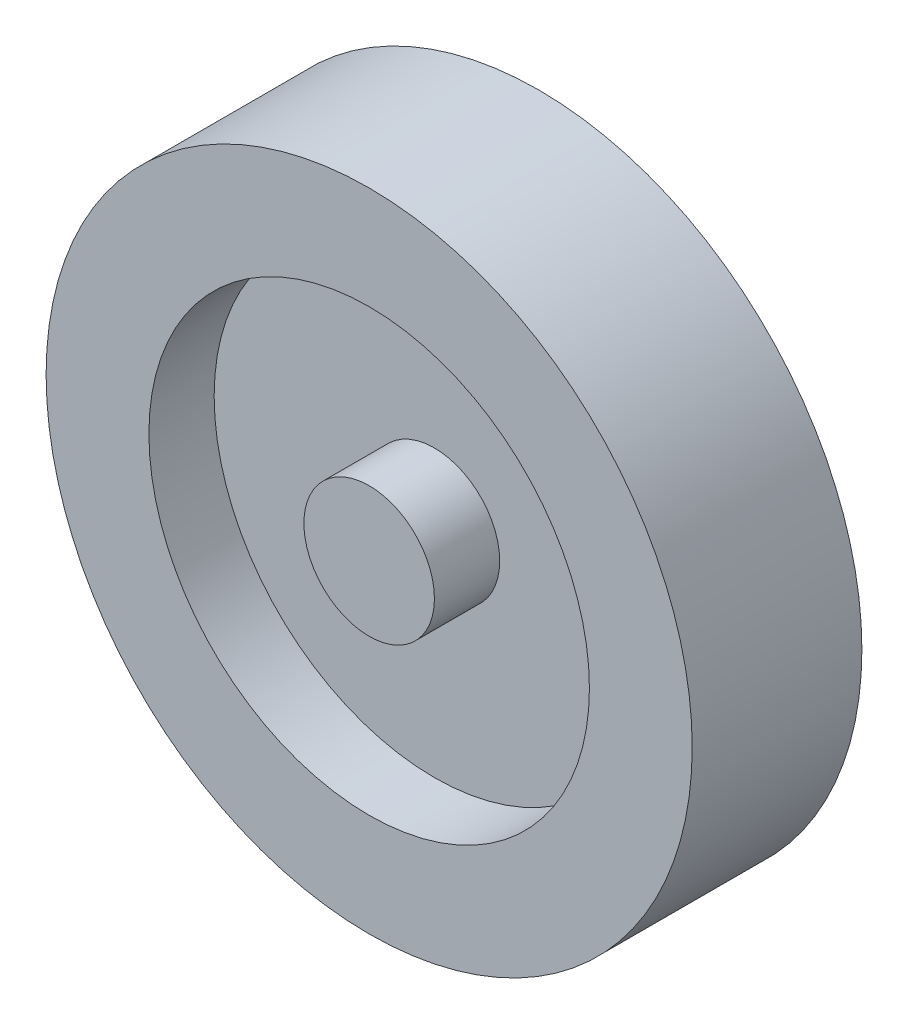
ISO-10303-21;
HEADER;
FILE_DESCRIPTION(('STEP AP214'),'2;1');
FILE_NAME('part.step','',(''),(''),'','','');
FILE_SCHEMA(('AUTOMOTIVE_DESIGN { 1 0 10303 214 1 1 1 1 }'));
ENDSEC;
DATA;
#1=APPLICATION_CONTEXT('core data for automotive mechanical design processes');
#2=APPLICATION_PROTOCOL_DEFINITION('international standard','automotive_design',2000,#1);
#3=PRODUCT_CONTEXT('',#1,'mechanical');
#4=PRODUCT('Part','Part','',(#3));
#5=PRODUCT_RELATED_PRODUCT_CATEGORY('part','',(#4));
#6=PRODUCT_DEFINITION_FORMATION('','',#4);
#7=PRODUCT_DEFINITION_CONTEXT('part definition',#1,'design');
#8=PRODUCT_DEFINITION('design','',#6,#7);
#9=PRODUCT_DEFINITION_SHAPE('','',#8);
#10=(LENGTH_UNIT() NAMED_UNIT(*) SI_UNIT(.MILLI.,.METRE.));
#11=(NAMED_UNIT(*) PLANE_ANGLE_UNIT() SI_UNIT($,.RADIAN.));
#12=(NAMED_UNIT(*) SI_UNIT($,.STERADIAN.) SOLID_ANGLE_UNIT());
#13=UNCERTAINTY_MEASURE_WITH_UNIT(LENGTH_MEASURE(1.E-05),#10,'distance_accuracy_value','');
#14=(GEOMETRIC_REPRESENTATION_CONTEXT(3) GLOBAL_UNCERTAINTY_ASSIGNED_CONTEXT((#13)) GLOBAL_UNIT_ASSIGNED_CONTEXT((#10,
#11,#12)) REPRESENTATION_CONTEXT('',''));
#15=CARTESIAN_POINT('',(0.,0.,0.));
#16=DIRECTION('',(0.,0.,1.));
#17=DIRECTION('',(1.,0.,0.));
#18=AXIS2_PLACEMENT_3D('',#15,#16,#17);
#19=CARTESIAN_POINT('',(0.,0.,13.));
#20=DIRECTION('',(0.,0.,-1.));
#21=DIRECTION('',(-1.,0.,0.));
#22=AXIS2_PLACEMENT_3D('',#19,#20,#21);
#23=CYLINDRICAL_SURFACE('',#22,49.5);
#24=CARTESIAN_POINT('',(0.,0.,13.));
#25=DIRECTION('',(0.,0.,1.));
#26=DIRECTION('',(1.,0.,0.));
#27=AXIS2_PLACEMENT_3D('',#24,#25,#26);
#28=CIRCLE('',#27,49.5);
#29=CARTESIAN_POINT('',(-49.5,0.,13.));
#30=VERTEX_POINT('',#29);
#31=EDGE_CURVE('E10',#30,#30,#28,.T.);
#32=CARTESIAN_POINT('',(0.,0.,-13.));
#33=DIRECTION('',(0.,0.,1.));
#34=DIRECTION('',(1.,0.,0.));
#35=AXIS2_PLACEMENT_3D('',#32,#33,#34);
#36=CIRCLE('',#35,49.5);
#37=CARTESIAN_POINT('',(-49.5,0.,-13.));
#38=VERTEX_POINT('',#37);
#39=EDGE_CURVE('E64',#38,#38,#36,.T.);
#40=CARTESIAN_POINT('',(-49.5,0.,13.));
#41=CARTESIAN_POINT('',(-49.5,0.,12.7291666666667));
#42=CARTESIAN_POINT('',(-49.5,0.,12.4583333333333));
#43=CARTESIAN_POINT('',(-49.5,0.,11.9166666666667));
#44=CARTESIAN_POINT('',(-49.5,0.,11.6458333333333));
#45=CARTESIAN_POINT('',(-49.5,0.,11.1041666666667));
#46=CARTESIAN_POINT('',(-49.5,0.,10.8333333333333));
#47=CARTESIAN_POINT('',(-49.5,0.,10.2916666666667));
#48=CARTESIAN_POINT('',(-49.5,0.,10.0208333333333));
#49=CARTESIAN_POINT('',(-49.5,0.,9.47916666666667));
#50=CARTESIAN_POINT('',(-49.5,0.,9.20833333333333));
#51=CARTESIAN_POINT('',(-49.5,0.,8.66666666666667));
#52=CARTESIAN_POINT('',(-49.5,0.,8.39583333333333));
#53=CARTESIAN_POINT('',(-49.5,0.,7.85416666666667));
#54=CARTESIAN_POINT('',(-49.5,0.,7.58333333333333));
#55=CARTESIAN_POINT('',(-49.5,0.,7.04166666666667));
#56=CARTESIAN_POINT('',(-49.5,0.,6.77083333333333));
#57=CARTESIAN_POINT('',(-49.5,0.,6.22916666666667));
#58=CARTESIAN_POINT('',(-49.5,0.,5.95833333333333));
#59=CARTESIAN_POINT('',(-49.5,0.,5.41666666666667));
#60=CARTESIAN_POINT('',(-49.5,0.,5.14583333333333));
#61=CARTESIAN_POINT('',(-49.5,0.,4.60416666666667));
#62=CARTESIAN_POINT('',(-49.5,0.,4.33333333333333));
#63=CARTESIAN_POINT('',(-49.5,0.,3.79166666666667));
#64=CARTESIAN_POINT('',(-49.5,0.,3.52083333333333));
#65=CARTESIAN_POINT('',(-49.5,0.,2.97916666666667));
#66=CARTESIAN_POINT('',(-49.5,0.,2.70833333333333));
#67=CARTESIAN_POINT('',(-49.5,0.,2.16666666666667));
#68=CARTESIAN_POINT('',(-49.5,0.,1.89583333333333));
#69=CARTESIAN_POINT('',(-49.5,0.,1.35416666666667));
#70=CARTESIAN_POINT('',(-49.5,0.,1.08333333333333));
#71=CARTESIAN_POINT('',(-49.5,0.,0.541666666666667));
#72=CARTESIAN_POINT('',(-49.5,0.,0.270833333333333));
#73=CARTESIAN_POINT('',(-49.5,0.,-0.270833333333333));
#74=CARTESIAN_POINT('',(-49.5,0.,-0.541666666666667));
#75=CARTESIAN_POINT('',(-49.5,0.,-1.08333333333333));
#76=CARTESIAN_POINT('',(-49.5,0.,-1.35416666666667));
#77=CARTESIAN_POINT('',(-49.5,0.,-1.89583333333333));
#78=CARTESIAN_POINT('',(-49.5,0.,-2.16666666666667));
#79=CARTESIAN_POINT('',(-49.5,0.,-2.70833333333333));
#80=CARTESIAN_POINT('',(-49.5,0.,-2.97916666666667));
#81=CARTESIAN_POINT('',(-49.5,0.,-3.52083333333333));
#82=CARTESIAN_POINT('',(-49.5,0.,-3.79166666666667));
#83=CARTESIAN_POINT('',(-49.5,0.,-4.33333333333333));
#84=CARTESIAN_POINT('',(-49.5,0.,-4.60416666666667));
#85=CARTESIAN_POINT('',(-49.5,0.,-5.14583333333333));
#86=CARTESIAN_POINT('',(-49.5,0.,-5.41666666666667));
#87=CARTESIAN_POINT('',(-49.5,0.,-5.95833333333333));
#88=CARTESIAN_POINT('',(-49.5,0.,-6.22916666666667));
#89=CARTESIAN_POINT('',(-49.5,0.,-6.77083333333333));
#90=CARTESIAN_POINT('',(-49.5,0.,-7.04166666666667));
#91=CARTESIAN_POINT('',(-49.5,0.,-7.58333333333333));
#92=CARTESIAN_POINT('',(-49.5,0.,-7.85416666666667));
#93=CARTESIAN_POINT('',(-49.5,0.,-8.39583333333333));
#94=CARTESIAN_POINT('',(-49.5,0.,-8.66666666666667));
#95=CARTESIAN_POINT('',(-49.5,0.,-9.20833333333333));
#96=CARTESIAN_POINT('',(-49.5,0.,-9.47916666666667));
#97=CARTESIAN_POINT('',(-49.5,0.,-10.0208333333333));
#98=CARTESIAN_POINT('',(-49.5,0.,-10.2916666666667));
#99=CARTESIAN_POINT('',(-49.5,0.,-10.8333333333333));
#100=CARTESIAN_POINT('',(-49.5,0.,-11.1041666666667));
#101=CARTESIAN_POINT('',(-49.5,0.,-11.6458333333333));
#102=CARTESIAN_POINT('',(-49.5,0.,-11.9166666666667));
#103=CARTESIAN_POINT('',(-49.5,0.,-12.4583333333333));
#104=CARTESIAN_POINT('',(-49.5,0.,-12.7291666666667));
#105=CARTESIAN_POINT('',(-49.5,0.,-13.));
#106=B_SPLINE_CURVE_WITH_KNOTS('',3,(#40,#41,#42,#43,#44,#45,#46,#47,#48,#49,#50,#51,#52,#53,
#54,#55,#56,#57,#58,#59,#60,#61,#62,#63,#64,#65,#66,#67,#68,#69,#70,#71,#72,#73,#74,#75,#76,#77,
#78,#79,#80,#81,#82,#83,#84,#85,#86,#87,#88,#89,#90,#91,#92,#93,#94,#95,#96,#97,#98,#99,#100,
#101,#102,#103,#104,#105),.UNSPECIFIED.,.F.,.F.,(4,2,2,2,2,2,2,2,2,2,2,2,2,2,2,2,2,2,2,2,2,2,2,
2,2,2,2,2,2,2,2,2,4),(0.,0.812500000000001,1.625,2.4375,3.25,4.0625,4.875,5.6875,6.5,7.3125,
8.125,8.9375,9.75,10.5625,11.375,12.1875,13.,13.8125,14.625,15.4375,16.25,17.0625,17.875,
18.6875,19.5,20.3125,21.125,21.9375,22.75,23.5625,24.375,25.1875,26.),.UNSPECIFIED.);
#107=EDGE_CURVE('BSEAM44',#30,#38,#106,.T.);
#108=ORIENTED_EDGE('',*,*,#31,.F.);
#109=ORIENTED_EDGE('',*,*,#39,.T.);
#110=ORIENTED_EDGE('',*,*,#107,.T.);
#111=ORIENTED_EDGE('',*,*,#107,.F.);
#112=EDGE_LOOP('',(#108,#110,#109,#111));
#113=FACE_BOUND('',#112,.T.);
#114=ADVANCED_FACE('F44',(#113),#23,.T.);
#115=CARTESIAN_POINT('',(0.,0.,13.));
#116=DIRECTION('',(0.,0.,1.));
#117=DIRECTION('',(1.,0.,0.));
#118=AXIS2_PLACEMENT_3D('',#115,#116,#117);
#119=PLANE('',#118);
#120=CARTESIAN_POINT('',(0.,0.,13.));
#121=DIRECTION('',(0.,0.,1.));
#122=DIRECTION('',(1.,0.,0.));
#123=AXIS2_PLACEMENT_3D('',#120,#121,#122);
#124=CIRCLE('',#123,33.75);
#125=CARTESIAN_POINT('',(33.75,0.,13.));
#126=VERTEX_POINT('',#125);
#127=EDGE_CURVE('E54',#126,#126,#124,.T.);
#128=ORIENTED_EDGE('',*,*,#127,.F.);
#129=EDGE_LOOP('',(#128));
#130=FACE_BOUND('',#129,.T.);
#131=ORIENTED_EDGE('',*,*,#31,.T.);
#132=EDGE_LOOP('',(#131));
#133=FACE_BOUND('',#132,.T.);
#134=ADVANCED_FACE('F115',(#130,#133),#119,.T.);
#135=CARTESIAN_POINT('',(0.,0.,3.));
#136=DIRECTION('',(0.,0.,1.));
#137=DIRECTION('',(1.,0.,0.));
#138=AXIS2_PLACEMENT_3D('',#135,#136,#137);
#139=CYLINDRICAL_SURFACE('',#138,33.75);
#140=CARTESIAN_POINT('',(0.,0.,3.));
#141=DIRECTION('',(0.,0.,1.));
#142=DIRECTION('',(1.,0.,0.));
#143=AXIS2_PLACEMENT_3D('',#140,#141,#142);
#144=CIRCLE('',#143,33.75);
#145=CARTESIAN_POINT('',(33.75,0.,3.));
#146=VERTEX_POINT('',#145);
#147=EDGE_CURVE('E50',#146,#146,#144,.T.);
#148=ORIENTED_EDGE('',*,*,#147,.F.);
#149=EDGE_LOOP('',(#148));
#150=FACE_BOUND('',#149,.T.);
#151=ORIENTED_EDGE('',*,*,#127,.T.);
#152=EDGE_LOOP('',(#151));
#153=FACE_BOUND('',#152,.T.);
#154=ADVANCED_FACE('F120',(#150,#153),#139,.F.);
#155=CARTESIAN_POINT('',(0.,0.,3.));
#156=DIRECTION('',(0.,0.,1.));
#157=DIRECTION('',(1.,0.,0.));
#158=AXIS2_PLACEMENT_3D('',#155,#156,#157);
#159=PLANE('',#158);
#160=CARTESIAN_POINT('',(0.,0.,3.));
#161=DIRECTION('',(0.,0.,1.));
#162=DIRECTION('',(1.,0.,0.));
#163=AXIS2_PLACEMENT_3D('',#160,#161,#162);
#164=CIRCLE('',#163,10.);
#165=CARTESIAN_POINT('',(10.,0.,3.));
#166=VERTEX_POINT('',#165);
#167=EDGE_CURVE('E59',#166,#166,#164,.T.);
#168=ORIENTED_EDGE('',*,*,#167,.F.);
#169=EDGE_LOOP('',(#168));
#170=FACE_BOUND('',#169,.T.);
#171=ORIENTED_EDGE('',*,*,#147,.T.);
#172=EDGE_LOOP('',(#171));
#173=FACE_BOUND('',#172,.T.);
#174=ADVANCED_FACE('F141',(#170,#173),#159,.T.);
#175=CARTESIAN_POINT('',(0.,0.,3.));
#176=DIRECTION('',(0.,0.,1.));
#177=DIRECTION('',(1.,0.,0.));
#178=AXIS2_PLACEMENT_3D('',#175,#176,#177);
#179=CYLINDRICAL_SURFACE('',#178,10.);
#180=ORIENTED_EDGE('',*,*,#167,.T.);
#181=EDGE_LOOP('',(#180));
#182=FACE_BOUND('',#181,.T.);
#183=CARTESIAN_POINT('',(0.,0.,13.));
#184=DIRECTION('',(0.,0.,1.));
#185=DIRECTION('',(1.,0.,0.));
#186=AXIS2_PLACEMENT_3D('',#183,#184,#185);
#187=CIRCLE('',#186,10.);
#188=CARTESIAN_POINT('',(10.,0.,13.));
#189=VERTEX_POINT('',#188);
#190=EDGE_CURVE('E61',#189,#189,#187,.T.);
#191=ORIENTED_EDGE('',*,*,#190,.F.);
#192=EDGE_LOOP('',(#191));
#193=FACE_BOUND('',#192,.T.);
#194=ADVANCED_FACE('F136',(#182,#193),#179,.T.);
#195=ORIENTED_EDGE('',*,*,#190,.T.);
#196=EDGE_LOOP('',(#195));
#197=FACE_BOUND('',#196,.T.);
#198=ADVANCED_FACE('F122',(#197),#119,.T.);
#199=CARTESIAN_POINT('',(0.,0.,-13.));
#200=DIRECTION('',(0.,0.,-1.));
#201=DIRECTION('',(1.,0.,0.));
#202=AXIS2_PLACEMENT_3D('',#199,#200,#201);
#203=PLANE('',#202);
#204=CARTESIAN_POINT('',(0.,0.,-13.));
#205=DIRECTION('',(0.,0.,1.));
#206=DIRECTION('',(1.,0.,0.));
#207=AXIS2_PLACEMENT_3D('',#204,#205,#206);
#208=CIRCLE('',#207,33.75);
#209=CARTESIAN_POINT('',(33.75,0.,-13.));
#210=VERTEX_POINT('',#209);
#211=EDGE_CURVE('E70',#210,#210,#208,.T.);
#212=ORIENTED_EDGE('',*,*,#211,.T.);
#213=EDGE_LOOP('',(#212));
#214=FACE_BOUND('',#213,.T.);
#215=ORIENTED_EDGE('',*,*,#39,.F.);
#216=EDGE_LOOP('',(#215));
#217=FACE_BOUND('',#216,.T.);
#218=ADVANCED_FACE('F126',(#214,#217),#203,.T.);
#219=CARTESIAN_POINT('',(0.,0.,-3.));
#220=DIRECTION('',(0.,0.,-1.));
#221=DIRECTION('',(1.,0.,0.));
#222=AXIS2_PLACEMENT_3D('',#219,#220,#221);
#223=CYLINDRICAL_SURFACE('',#222,33.75);
#224=CARTESIAN_POINT('',(0.,0.,-3.));
#225=DIRECTION('',(0.,0.,1.));
#226=DIRECTION('',(1.,0.,0.));
#227=AXIS2_PLACEMENT_3D('',#224,#225,#226);
#228=CIRCLE('',#227,33.75);
#229=CARTESIAN_POINT('',(33.75,0.,-3.));
#230=VERTEX_POINT('',#229);
#231=EDGE_CURVE('E69',#230,#230,#228,.T.);
#232=ORIENTED_EDGE('',*,*,#231,.T.);
#233=EDGE_LOOP('',(#232));
#234=FACE_BOUND('',#233,.T.);
#235=ORIENTED_EDGE('',*,*,#211,.F.);
#236=EDGE_LOOP('',(#235));
#237=FACE_BOUND('',#236,.T.);
#238=ADVANCED_FACE('F110',(#234,#237),#223,.F.);
#239=CARTESIAN_POINT('',(0.,0.,-3.));
#240=DIRECTION('',(0.,0.,-1.));
#241=DIRECTION('',(1.,0.,0.));
#242=AXIS2_PLACEMENT_3D('',#239,#240,#241);
#243=PLANE('',#242);
#244=CARTESIAN_POINT('',(0.,0.,-3.));
#245=DIRECTION('',(0.,0.,1.));
#246=DIRECTION('',(1.,0.,0.));
#247=AXIS2_PLACEMENT_3D('',#244,#245,#246);
#248=CIRCLE('',#247,10.);
#249=CARTESIAN_POINT('',(10.,0.,-3.));
#250=VERTEX_POINT('',#249);
#251=EDGE_CURVE('E73',#250,#250,#248,.T.);
#252=ORIENTED_EDGE('',*,*,#251,.T.);
#253=EDGE_LOOP('',(#252));
#254=FACE_BOUND('',#253,.T.);
#255=ORIENTED_EDGE('',*,*,#231,.F.);
#256=EDGE_LOOP('',(#255));
#257=FACE_BOUND('',#256,.T.);
#258=ADVANCED_FACE('F104',(#254,#257),#243,.T.);
#259=CARTESIAN_POINT('',(0.,0.,-3.));
#260=DIRECTION('',(0.,0.,-1.));
#261=DIRECTION('',(1.,0.,0.));
#262=AXIS2_PLACEMENT_3D('',#259,#260,#261);
#263=CYLINDRICAL_SURFACE('',#262,10.);
#264=ORIENTED_EDGE('',*,*,#251,.F.);
#265=EDGE_LOOP('',(#264));
#266=FACE_BOUND('',#265,.T.);
#267=CARTESIAN_POINT('',(0.,0.,-31.5));
#268=DIRECTION('',(0.,0.,-1.));
#269=DIRECTION('',(-1.,0.,0.));
#270=AXIS2_PLACEMENT_3D('',#267,#268,#269);
#271=CIRCLE('',#270,10.);
#272=CARTESIAN_POINT('',(-10.,0.,-31.5));
#273=VERTEX_POINT('',#272);
#274=EDGE_CURVE('E78',#273,#273,#271,.T.);
#275=ORIENTED_EDGE('',*,*,#274,.F.);
#276=EDGE_LOOP('',(#275));
#277=FACE_BOUND('',#276,.T.);
#278=ADVANCED_FACE('F99',(#266,#277),#263,.T.);
#279=CARTESIAN_POINT('',(0.,0.,-31.5));
#280=DIRECTION('',(0.,0.,-1.));
#281=DIRECTION('',(-1.,0.,0.));
#282=AXIS2_PLACEMENT_3D('',#279,#280,#281);
#283=PLANE('',#282);
#284=CARTESIAN_POINT('',(0.,0.,-31.5));
#285=DIRECTION('',(0.,0.,-1.));
#286=DIRECTION('',(-1.,0.,0.));
#287=AXIS2_PLACEMENT_3D('',#284,#285,#286);
#288=CIRCLE('',#287,3.);
#289=CARTESIAN_POINT('',(-3.,0.,-31.5));
#290=VERTEX_POINT('',#289);
#291=EDGE_CURVE('E82',#290,#290,#288,.T.);
#292=ORIENTED_EDGE('',*,*,#291,.F.);
#293=EDGE_LOOP('',(#292));
#294=FACE_BOUND('',#293,.T.);
#295=ORIENTED_EDGE('',*,*,#274,.T.);
#296=EDGE_LOOP('',(#295));
#297=FACE_BOUND('',#296,.T.);
#298=ADVANCED_FACE('F93',(#294,#297),#283,.T.);
#299=CARTESIAN_POINT('',(0.,0.,-21.5));
#300=DIRECTION('',(0.,0.,-1.));
#301=DIRECTION('',(-1.,0.,0.));
#302=AXIS2_PLACEMENT_3D('',#299,#300,#301);
#303=CYLINDRICAL_SURFACE('',#302,3.);
#304=CARTESIAN_POINT('',(0.,0.,-21.5));
#305=DIRECTION('',(0.,0.,-1.));
#306=DIRECTION('',(-1.,0.,0.));
#307=AXIS2_PLACEMENT_3D('',#304,#305,#306);
#308=CIRCLE('',#307,3.);
#309=CARTESIAN_POINT('',(-3.,0.,-21.5));
#310=VERTEX_POINT('',#309);
#311=EDGE_CURVE('E81',#310,#310,#308,.T.);
#312=ORIENTED_EDGE('',*,*,#311,.F.);
#313=EDGE_LOOP('',(#312));
#314=FACE_BOUND('',#313,.T.);
#315=ORIENTED_EDGE('',*,*,#291,.T.);
#316=EDGE_LOOP('',(#315));
#317=FACE_BOUND('',#316,.T.);
#318=ADVANCED_FACE('F90',(#314,#317),#303,.F.);
#319=CARTESIAN_POINT('',(0.,0.,-21.5));
#320=DIRECTION('',(0.,0.,-1.));
#321=DIRECTION('',(-1.,0.,0.));
#322=AXIS2_PLACEMENT_3D('',#319,#320,#321);
#323=PLANE('',#322);
#324=ORIENTED_EDGE('',*,*,#311,.T.);
#325=EDGE_LOOP('',(#324));
#326=FACE_BOUND('',#325,.T.);
#327=ADVANCED_FACE('F88',(#326),#323,.T.);
#328=CLOSED_SHELL('',(#114,#134,#154,#174,#194,#198,#218,#238,#258,#278,#298,#318,#327));
#329=MANIFOLD_SOLID_BREP('B2',#328);
#330=ADVANCED_BREP_SHAPE_REPRESENTATION('',(#18,#329),#14);
#331=SHAPE_DEFINITION_REPRESENTATION(#9,#330);
ENDSEC;
END-ISO-10303-21;
